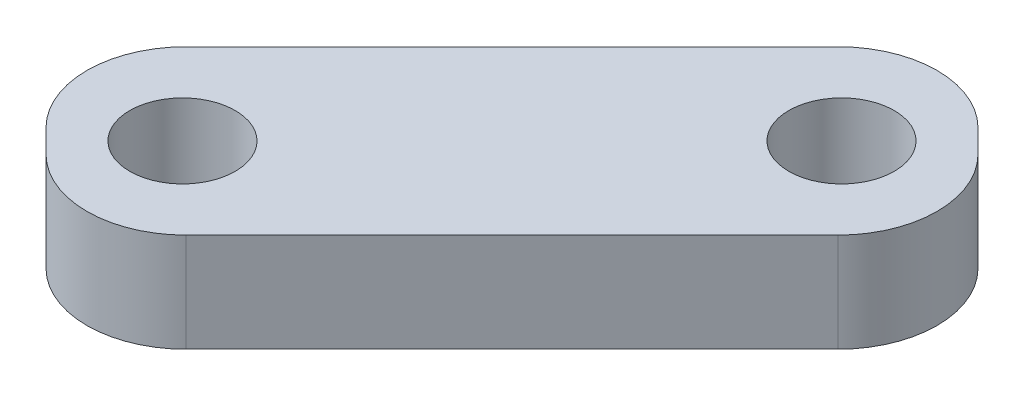
ISO-10303-21;
HEADER;
FILE_DESCRIPTION(('STEP AP214'),'2;1');
FILE_NAME('part.step','',(''),(''),'','','');
FILE_SCHEMA(('AUTOMOTIVE_DESIGN { 1 0 10303 214 1 1 1 1 }'));
ENDSEC;
DATA;
#1=APPLICATION_CONTEXT('core data for automotive mechanical design processes');
#2=APPLICATION_PROTOCOL_DEFINITION('international standard','automotive_design',2000,#1);
#3=PRODUCT_CONTEXT('',#1,'mechanical');
#4=PRODUCT('Part','Part','',(#3));
#5=PRODUCT_RELATED_PRODUCT_CATEGORY('part','',(#4));
#6=PRODUCT_DEFINITION_FORMATION('','',#4);
#7=PRODUCT_DEFINITION_CONTEXT('part definition',#1,'design');
#8=PRODUCT_DEFINITION('design','',#6,#7);
#9=PRODUCT_DEFINITION_SHAPE('','',#8);
#10=(LENGTH_UNIT() NAMED_UNIT(*) SI_UNIT(.MILLI.,.METRE.));
#11=(NAMED_UNIT(*) PLANE_ANGLE_UNIT() SI_UNIT($,.RADIAN.));
#12=(NAMED_UNIT(*) SI_UNIT($,.STERADIAN.) SOLID_ANGLE_UNIT());
#13=UNCERTAINTY_MEASURE_WITH_UNIT(LENGTH_MEASURE(1.E-05),#10,'distance_accuracy_value','');
#14=(GEOMETRIC_REPRESENTATION_CONTEXT(3) GLOBAL_UNCERTAINTY_ASSIGNED_CONTEXT((#13)) GLOBAL_UNIT_ASSIGNED_CONTEXT((#10,
#11,#12)) REPRESENTATION_CONTEXT('',''));
#15=CARTESIAN_POINT('',(0.,0.,0.));
#16=DIRECTION('',(0.,0.,1.));
#17=DIRECTION('',(1.,0.,0.));
#18=AXIS2_PLACEMENT_3D('',#15,#16,#17);
#19=CARTESIAN_POINT('',(0.,3.,0.));
#20=DIRECTION('',(0.,-1.,0.));
#21=DIRECTION('',(0.,0.,-1.));
#22=AXIS2_PLACEMENT_3D('',#19,#20,#21);
#23=PLANE('',#22);
#24=DIRECTION('',(0.707106781186547,0.,-0.707106781186548));
#25=VECTOR('',#24,1.);
#26=CARTESIAN_POINT('',(9.54594154601839,3.,-4.59619407771256));
#27=LINE('',#26,#25);
#28=CARTESIAN_POINT('',(-2.47487373415292,3.,7.42462120245875));
#29=VERTEX_POINT('',#28);
#30=CARTESIAN_POINT('',(7.42462120245875,3.,-2.47487373415292));
#31=VERTEX_POINT('',#30);
#32=EDGE_CURVE('E169',#29,#31,#27,.T.);
#33=ORIENTED_EDGE('',*,*,#32,.T.);
#34=CARTESIAN_POINT('',(5.3033008588991,3.,-4.59619407771256));
#35=DIRECTION('',(0.,-1.,0.));
#36=DIRECTION('',(0.,0.,-1.));
#37=AXIS2_PLACEMENT_3D('',#34,#35,#36);
#38=CIRCLE('',#37,3.);
#39=CARTESIAN_POINT('',(7.42462120245875,3.,-6.7175144212722));
#40=VERTEX_POINT('',#39);
#41=EDGE_CURVE('E147',#31,#40,#38,.F.);
#42=ORIENTED_EDGE('',*,*,#41,.T.);
#43=DIRECTION('',(-0.707106781186548,0.,-0.707106781186547));
#44=VECTOR('',#43,1.);
#45=CARTESIAN_POINT('',(4.59619407771256,3.,-9.54594154601839));
#46=LINE('',#45,#44);
#47=CARTESIAN_POINT('',(6.7175144212722,3.,-7.42462120245875));
#48=VERTEX_POINT('',#47);
#49=EDGE_CURVE('E117',#40,#48,#46,.T.);
#50=ORIENTED_EDGE('',*,*,#49,.T.);
#51=CARTESIAN_POINT('',(4.59619407771256,3.,-5.30330085889911));
#52=DIRECTION('',(0.,-1.,0.));
#53=DIRECTION('',(0.,0.,-1.));
#54=AXIS2_PLACEMENT_3D('',#51,#52,#53);
#55=CIRCLE('',#54,3.);
#56=CARTESIAN_POINT('',(2.47487373415292,3.,-7.42462120245875));
#57=VERTEX_POINT('',#56);
#58=EDGE_CURVE('E53',#48,#57,#55,.F.);
#59=ORIENTED_EDGE('',*,*,#58,.T.);
#60=DIRECTION('',(-0.707106781186547,0.,0.707106781186548));
#61=VECTOR('',#60,1.);
#62=CARTESIAN_POINT('',(-9.54594154601839,3.,4.59619407771256));
#63=LINE('',#62,#61);
#64=CARTESIAN_POINT('',(-7.42462120245875,3.,2.47487373415292));
#65=VERTEX_POINT('',#64);
#66=EDGE_CURVE('E133',#57,#65,#63,.T.);
#67=ORIENTED_EDGE('',*,*,#66,.T.);
#68=CARTESIAN_POINT('',(-5.30330085889911,3.,4.59619407771256));
#69=DIRECTION('',(0.,-1.,0.));
#70=DIRECTION('',(0.,0.,-1.));
#71=AXIS2_PLACEMENT_3D('',#68,#69,#70);
#72=CIRCLE('',#71,3.);
#73=CARTESIAN_POINT('',(-7.42462120245875,3.,6.71751442127221));
#74=VERTEX_POINT('',#73);
#75=EDGE_CURVE('E143',#65,#74,#72,.F.);
#76=ORIENTED_EDGE('',*,*,#75,.T.);
#77=DIRECTION('',(0.707106781186548,0.,0.707106781186547));
#78=VECTOR('',#77,1.);
#79=CARTESIAN_POINT('',(-4.59619407771256,3.,9.54594154601839));
#80=LINE('',#79,#78);
#81=CARTESIAN_POINT('',(-6.7175144212722,3.,7.42462120245875));
#82=VERTEX_POINT('',#81);
#83=EDGE_CURVE('E127',#74,#82,#80,.T.);
#84=ORIENTED_EDGE('',*,*,#83,.T.);
#85=CARTESIAN_POINT('',(-4.59619407771256,3.,5.30330085889911));
#86=DIRECTION('',(0.,-1.,0.));
#87=DIRECTION('',(0.,0.,-1.));
#88=AXIS2_PLACEMENT_3D('',#85,#86,#87);
#89=CIRCLE('',#88,3.);
#90=EDGE_CURVE('E145',#82,#29,#89,.F.);
#91=ORIENTED_EDGE('',*,*,#90,.T.);
#92=EDGE_LOOP('',(#33,#42,#50,#59,#67,#76,#84,#91));
#93=FACE_BOUND('',#92,.T.);
#94=CARTESIAN_POINT('',(-5.,3.,5.));
#95=DIRECTION('',(0.,1.,0.));
#96=DIRECTION('',(0.,0.,1.));
#97=AXIS2_PLACEMENT_3D('',#94,#95,#96);
#98=CIRCLE('',#97,1.6);
#99=CARTESIAN_POINT('',(-5.,3.,6.6));
#100=VERTEX_POINT('',#99);
#101=EDGE_CURVE('E178',#100,#100,#98,.T.);
#102=ORIENTED_EDGE('',*,*,#101,.F.);
#103=EDGE_LOOP('',(#102));
#104=FACE_BOUND('',#103,.T.);
#105=CARTESIAN_POINT('',(5.,3.,-5.));
#106=DIRECTION('',(0.,1.,0.));
#107=DIRECTION('',(0.,0.,1.));
#108=AXIS2_PLACEMENT_3D('',#105,#106,#107);
#109=CIRCLE('',#108,1.6);
#110=CARTESIAN_POINT('',(5.,3.,-3.4));
#111=VERTEX_POINT('',#110);
#112=EDGE_CURVE('E183',#111,#111,#109,.T.);
#113=ORIENTED_EDGE('',*,*,#112,.F.);
#114=EDGE_LOOP('',(#113));
#115=FACE_BOUND('',#114,.T.);
#116=ADVANCED_FACE('F33',(#93,#104,#115),#23,.F.);
#117=CARTESIAN_POINT('',(0.,0.,0.));
#118=DIRECTION('',(0.,-1.,0.));
#119=DIRECTION('',(0.,0.,-1.));
#120=AXIS2_PLACEMENT_3D('',#117,#118,#119);
#121=PLANE('',#120);
#122=CARTESIAN_POINT('',(-5.,0.,5.));
#123=DIRECTION('',(0.,1.,0.));
#124=DIRECTION('',(0.,0.,1.));
#125=AXIS2_PLACEMENT_3D('',#122,#123,#124);
#126=CIRCLE('',#125,1.6);
#127=CARTESIAN_POINT('',(-5.,0.,6.6));
#128=VERTEX_POINT('',#127);
#129=EDGE_CURVE('E174',#128,#128,#126,.T.);
#130=ORIENTED_EDGE('',*,*,#129,.T.);
#131=EDGE_LOOP('',(#130));
#132=FACE_BOUND('',#131,.T.);
#133=DIRECTION('',(-0.707106781186548,0.,-0.707106781186547));
#134=VECTOR('',#133,1.);
#135=CARTESIAN_POINT('',(4.59619407771256,0.,-9.54594154601839));
#136=LINE('',#135,#134);
#137=CARTESIAN_POINT('',(7.42462120245875,0.,-6.7175144212722));
#138=VERTEX_POINT('',#137);
#139=CARTESIAN_POINT('',(6.7175144212722,0.,-7.42462120245875));
#140=VERTEX_POINT('',#139);
#141=EDGE_CURVE('E115',#138,#140,#136,.T.);
#142=ORIENTED_EDGE('',*,*,#141,.F.);
#143=CARTESIAN_POINT('',(5.3033008588991,0.,-4.59619407771256));
#144=DIRECTION('',(0.,-1.,0.));
#145=DIRECTION('',(0.,0.,-1.));
#146=AXIS2_PLACEMENT_3D('',#143,#144,#145);
#147=CIRCLE('',#146,3.);
#148=CARTESIAN_POINT('',(7.42462120245875,0.,-2.47487373415292));
#149=VERTEX_POINT('',#148);
#150=EDGE_CURVE('E98',#138,#149,#147,.T.);
#151=ORIENTED_EDGE('',*,*,#150,.T.);
#152=DIRECTION('',(0.707106781186547,0.,-0.707106781186548));
#153=VECTOR('',#152,1.);
#154=CARTESIAN_POINT('',(9.54594154601839,0.,-4.59619407771256));
#155=LINE('',#154,#153);
#156=CARTESIAN_POINT('',(-2.47487373415292,0.,7.42462120245875));
#157=VERTEX_POINT('',#156);
#158=EDGE_CURVE('E125',#157,#149,#155,.T.);
#159=ORIENTED_EDGE('',*,*,#158,.F.);
#160=CARTESIAN_POINT('',(-4.59619407771256,0.,5.30330085889911));
#161=DIRECTION('',(0.,-1.,0.));
#162=DIRECTION('',(0.,0.,-1.));
#163=AXIS2_PLACEMENT_3D('',#160,#161,#162);
#164=CIRCLE('',#163,3.);
#165=CARTESIAN_POINT('',(-6.7175144212722,0.,7.42462120245875));
#166=VERTEX_POINT('',#165);
#167=EDGE_CURVE('E109',#157,#166,#164,.T.);
#168=ORIENTED_EDGE('',*,*,#167,.T.);
#169=DIRECTION('',(0.707106781186548,0.,0.707106781186547));
#170=VECTOR('',#169,1.);
#171=CARTESIAN_POINT('',(-4.59619407771256,0.,9.54594154601839));
#172=LINE('',#171,#170);
#173=CARTESIAN_POINT('',(-7.42462120245875,0.,6.71751442127221));
#174=VERTEX_POINT('',#173);
#175=EDGE_CURVE('E129',#174,#166,#172,.T.);
#176=ORIENTED_EDGE('',*,*,#175,.F.);
#177=CARTESIAN_POINT('',(-5.30330085889911,0.,4.59619407771256));
#178=DIRECTION('',(0.,-1.,0.));
#179=DIRECTION('',(0.,0.,-1.));
#180=AXIS2_PLACEMENT_3D('',#177,#178,#179);
#181=CIRCLE('',#180,3.);
#182=CARTESIAN_POINT('',(-7.42462120245875,0.,2.47487373415292));
#183=VERTEX_POINT('',#182);
#184=EDGE_CURVE('E136',#174,#183,#181,.T.);
#185=ORIENTED_EDGE('',*,*,#184,.T.);
#186=DIRECTION('',(-0.707106781186547,0.,0.707106781186548));
#187=VECTOR('',#186,1.);
#188=CARTESIAN_POINT('',(-9.54594154601839,0.,4.59619407771256));
#189=LINE('',#188,#187);
#190=CARTESIAN_POINT('',(2.47487373415292,0.,-7.42462120245875));
#191=VERTEX_POINT('',#190);
#192=EDGE_CURVE('E124',#191,#183,#189,.T.);
#193=ORIENTED_EDGE('',*,*,#192,.F.);
#194=CARTESIAN_POINT('',(4.59619407771256,0.,-5.30330085889911));
#195=DIRECTION('',(0.,-1.,0.));
#196=DIRECTION('',(0.,0.,-1.));
#197=AXIS2_PLACEMENT_3D('',#194,#195,#196);
#198=CIRCLE('',#197,3.);
#199=EDGE_CURVE('E118',#191,#140,#198,.T.);
#200=ORIENTED_EDGE('',*,*,#199,.T.);
#201=EDGE_LOOP('',(#142,#151,#159,#168,#176,#185,#193,#200));
#202=FACE_BOUND('',#201,.T.);
#203=CARTESIAN_POINT('',(5.,0.,-5.));
#204=DIRECTION('',(0.,1.,0.));
#205=DIRECTION('',(0.,0.,1.));
#206=AXIS2_PLACEMENT_3D('',#203,#204,#205);
#207=CIRCLE('',#206,1.6);
#208=CARTESIAN_POINT('',(5.,0.,-3.4));
#209=VERTEX_POINT('',#208);
#210=EDGE_CURVE('E185',#209,#209,#207,.T.);
#211=ORIENTED_EDGE('',*,*,#210,.T.);
#212=EDGE_LOOP('',(#211));
#213=FACE_BOUND('',#212,.T.);
#214=ADVANCED_FACE('F121',(#132,#202,#213),#121,.T.);
#215=CARTESIAN_POINT('',(-4.59619407771256,3.,9.54594154601839));
#216=DIRECTION('',(0.707106781186547,0.,-0.707106781186548));
#217=DIRECTION('',(-0.707106781186548,0.,-0.707106781186547));
#218=AXIS2_PLACEMENT_3D('',#215,#216,#217);
#219=PLANE('',#218);
#220=ORIENTED_EDGE('',*,*,#175,.T.);
#221=DIRECTION('',(0.,-1.,0.));
#222=VECTOR('',#221,1.);
#223=CARTESIAN_POINT('',(-6.7175144212722,3.,7.42462120245875));
#224=LINE('',#223,#222);
#225=EDGE_CURVE('E152',#166,#82,#224,.F.);
#226=ORIENTED_EDGE('',*,*,#225,.T.);
#227=ORIENTED_EDGE('',*,*,#83,.F.);
#228=DIRECTION('',(0.,-1.,0.));
#229=VECTOR('',#228,1.);
#230=CARTESIAN_POINT('',(-7.42462120245875,3.,6.71751442127221));
#231=LINE('',#230,#229);
#232=EDGE_CURVE('E149',#74,#174,#231,.T.);
#233=ORIENTED_EDGE('',*,*,#232,.T.);
#234=EDGE_LOOP('',(#220,#226,#227,#233));
#235=FACE_BOUND('',#234,.T.);
#236=ADVANCED_FACE('F165',(#235),#219,.F.);
#237=CARTESIAN_POINT('',(9.54594154601839,3.,-4.59619407771256));
#238=DIRECTION('',(-0.707106781186548,0.,-0.707106781186547));
#239=DIRECTION('',(-0.707106781186547,0.,0.707106781186548));
#240=AXIS2_PLACEMENT_3D('',#237,#238,#239);
#241=PLANE('',#240);
#242=ORIENTED_EDGE('',*,*,#158,.T.);
#243=DIRECTION('',(0.,-1.,0.));
#244=VECTOR('',#243,1.);
#245=CARTESIAN_POINT('',(7.42462120245875,3.,-2.47487373415292));
#246=LINE('',#245,#244);
#247=EDGE_CURVE('E103',#149,#31,#246,.F.);
#248=ORIENTED_EDGE('',*,*,#247,.T.);
#249=ORIENTED_EDGE('',*,*,#32,.F.);
#250=DIRECTION('',(0.,-1.,0.));
#251=VECTOR('',#250,1.);
#252=CARTESIAN_POINT('',(-2.47487373415291,3.,7.42462120245875));
#253=LINE('',#252,#251);
#254=EDGE_CURVE('E108',#29,#157,#253,.T.);
#255=ORIENTED_EDGE('',*,*,#254,.T.);
#256=EDGE_LOOP('',(#242,#248,#249,#255));
#257=FACE_BOUND('',#256,.T.);
#258=ADVANCED_FACE('F210',(#257),#241,.F.);
#259=CARTESIAN_POINT('',(4.59619407771256,3.,-9.54594154601839));
#260=DIRECTION('',(-0.707106781186547,0.,0.707106781186548));
#261=DIRECTION('',(0.707106781186548,0.,0.707106781186547));
#262=AXIS2_PLACEMENT_3D('',#259,#260,#261);
#263=PLANE('',#262);
#264=ORIENTED_EDGE('',*,*,#49,.F.);
#265=DIRECTION('',(0.,-1.,0.));
#266=VECTOR('',#265,1.);
#267=CARTESIAN_POINT('',(7.42462120245875,3.,-6.7175144212722));
#268=LINE('',#267,#266);
#269=EDGE_CURVE('E102',#40,#138,#268,.T.);
#270=ORIENTED_EDGE('',*,*,#269,.T.);
#271=ORIENTED_EDGE('',*,*,#141,.T.);
#272=DIRECTION('',(0.,-1.,0.));
#273=VECTOR('',#272,1.);
#274=CARTESIAN_POINT('',(6.7175144212722,3.,-7.42462120245875));
#275=LINE('',#274,#273);
#276=EDGE_CURVE('E119',#140,#48,#275,.F.);
#277=ORIENTED_EDGE('',*,*,#276,.T.);
#278=EDGE_LOOP('',(#264,#270,#271,#277));
#279=FACE_BOUND('',#278,.T.);
#280=ADVANCED_FACE('F114',(#279),#263,.F.);
#281=CARTESIAN_POINT('',(-9.54594154601839,3.,4.59619407771256));
#282=DIRECTION('',(0.707106781186548,0.,0.707106781186547));
#283=DIRECTION('',(0.707106781186547,0.,-0.707106781186548));
#284=AXIS2_PLACEMENT_3D('',#281,#282,#283);
#285=PLANE('',#284);
#286=ORIENTED_EDGE('',*,*,#192,.T.);
#287=DIRECTION('',(0.,-1.,0.));
#288=VECTOR('',#287,1.);
#289=CARTESIAN_POINT('',(-7.42462120245875,3.,2.47487373415292));
#290=LINE('',#289,#288);
#291=EDGE_CURVE('E11',#183,#65,#290,.F.);
#292=ORIENTED_EDGE('',*,*,#291,.T.);
#293=ORIENTED_EDGE('',*,*,#66,.F.);
#294=DIRECTION('',(0.,-1.,0.));
#295=VECTOR('',#294,1.);
#296=CARTESIAN_POINT('',(2.47487373415291,3.,-7.42462120245875));
#297=LINE('',#296,#295);
#298=EDGE_CURVE('E41',#57,#191,#297,.T.);
#299=ORIENTED_EDGE('',*,*,#298,.T.);
#300=EDGE_LOOP('',(#286,#292,#293,#299));
#301=FACE_BOUND('',#300,.T.);
#302=ADVANCED_FACE('F155',(#301),#285,.F.);
#303=CARTESIAN_POINT('',(-5.,3.,5.));
#304=DIRECTION('',(0.,-1.,0.));
#305=DIRECTION('',(0.,0.,-1.));
#306=AXIS2_PLACEMENT_3D('',#303,#304,#305);
#307=CYLINDRICAL_SURFACE('',#306,1.6);
#308=ORIENTED_EDGE('',*,*,#101,.T.);
#309=EDGE_LOOP('',(#308));
#310=FACE_BOUND('',#309,.T.);
#311=ORIENTED_EDGE('',*,*,#129,.F.);
#312=EDGE_LOOP('',(#311));
#313=FACE_BOUND('',#312,.T.);
#314=ADVANCED_FACE('F203',(#310,#313),#307,.F.);
#315=CARTESIAN_POINT('',(5.,3.,-5.));
#316=DIRECTION('',(0.,-1.,0.));
#317=DIRECTION('',(0.,0.,-1.));
#318=AXIS2_PLACEMENT_3D('',#315,#316,#317);
#319=CYLINDRICAL_SURFACE('',#318,1.6);
#320=ORIENTED_EDGE('',*,*,#112,.T.);
#321=EDGE_LOOP('',(#320));
#322=FACE_BOUND('',#321,.T.);
#323=ORIENTED_EDGE('',*,*,#210,.F.);
#324=EDGE_LOOP('',(#323));
#325=FACE_BOUND('',#324,.T.);
#326=ADVANCED_FACE('F191',(#322,#325),#319,.F.);
#327=CARTESIAN_POINT('',(5.3033008588991,3.,-4.59619407771256));
#328=DIRECTION('',(0.,-1.,0.));
#329=DIRECTION('',(0.,0.,-1.));
#330=AXIS2_PLACEMENT_3D('',#327,#328,#329);
#331=CYLINDRICAL_SURFACE('',#330,3.);
#332=ORIENTED_EDGE('',*,*,#41,.F.);
#333=ORIENTED_EDGE('',*,*,#247,.F.);
#334=ORIENTED_EDGE('',*,*,#150,.F.);
#335=ORIENTED_EDGE('',*,*,#269,.F.);
#336=EDGE_LOOP('',(#332,#333,#334,#335));
#337=FACE_BOUND('',#336,.T.);
#338=ADVANCED_FACE('F101',(#337),#331,.T.);
#339=CARTESIAN_POINT('',(-4.59619407771256,3.,5.30330085889911));
#340=DIRECTION('',(0.,-1.,0.));
#341=DIRECTION('',(0.,0.,-1.));
#342=AXIS2_PLACEMENT_3D('',#339,#340,#341);
#343=CYLINDRICAL_SURFACE('',#342,3.);
#344=ORIENTED_EDGE('',*,*,#90,.F.);
#345=ORIENTED_EDGE('',*,*,#225,.F.);
#346=ORIENTED_EDGE('',*,*,#167,.F.);
#347=ORIENTED_EDGE('',*,*,#254,.F.);
#348=EDGE_LOOP('',(#344,#345,#346,#347));
#349=FACE_BOUND('',#348,.T.);
#350=ADVANCED_FACE('F218',(#349),#343,.T.);
#351=CARTESIAN_POINT('',(-5.30330085889911,3.,4.59619407771256));
#352=DIRECTION('',(0.,-1.,0.));
#353=DIRECTION('',(0.,0.,-1.));
#354=AXIS2_PLACEMENT_3D('',#351,#352,#353);
#355=CYLINDRICAL_SURFACE('',#354,3.);
#356=ORIENTED_EDGE('',*,*,#75,.F.);
#357=ORIENTED_EDGE('',*,*,#291,.F.);
#358=ORIENTED_EDGE('',*,*,#184,.F.);
#359=ORIENTED_EDGE('',*,*,#232,.F.);
#360=EDGE_LOOP('',(#356,#357,#358,#359));
#361=FACE_BOUND('',#360,.T.);
#362=ADVANCED_FACE('F162',(#361),#355,.T.);
#363=CARTESIAN_POINT('',(4.59619407771256,3.,-5.30330085889911));
#364=DIRECTION('',(0.,-1.,0.));
#365=DIRECTION('',(0.,0.,-1.));
#366=AXIS2_PLACEMENT_3D('',#363,#364,#365);
#367=CYLINDRICAL_SURFACE('',#366,3.);
#368=ORIENTED_EDGE('',*,*,#58,.F.);
#369=ORIENTED_EDGE('',*,*,#276,.F.);
#370=ORIENTED_EDGE('',*,*,#199,.F.);
#371=ORIENTED_EDGE('',*,*,#298,.F.);
#372=EDGE_LOOP('',(#368,#369,#370,#371));
#373=FACE_BOUND('',#372,.T.);
#374=ADVANCED_FACE('F35',(#373),#367,.T.);
#375=CLOSED_SHELL('',(#116,#214,#236,#258,#280,#302,#314,#326,#338,#350,#362,#374));
#376=MANIFOLD_SOLID_BREP('B2',#375);
#377=ADVANCED_BREP_SHAPE_REPRESENTATION('',(#18,#376),#14);
#378=SHAPE_DEFINITION_REPRESENTATION(#9,#377);
ENDSEC;
END-ISO-10303-21;
